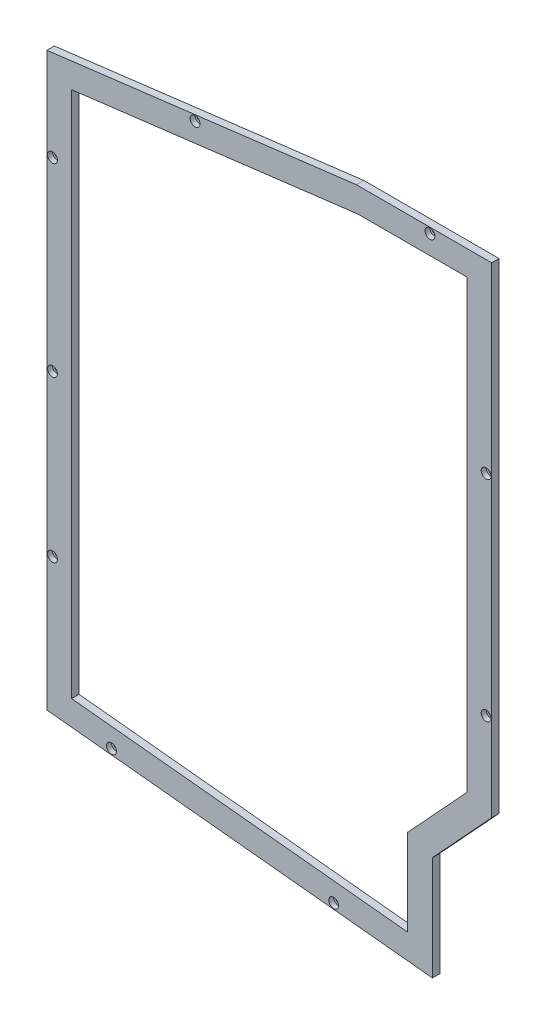
ISO-10303-21;
HEADER;
FILE_DESCRIPTION(('STEP AP214'),'2;1');
FILE_NAME('part.step','',(''),(''),'','','');
FILE_SCHEMA(('AUTOMOTIVE_DESIGN { 1 0 10303 214 1 1 1 1 }'));
ENDSEC;
DATA;
#1=APPLICATION_CONTEXT('core data for automotive mechanical design processes');
#2=APPLICATION_PROTOCOL_DEFINITION('international standard','automotive_design',2000,#1);
#3=PRODUCT_CONTEXT('',#1,'mechanical');
#4=PRODUCT('Part','Part','',(#3));
#5=PRODUCT_RELATED_PRODUCT_CATEGORY('part','',(#4));
#6=PRODUCT_DEFINITION_FORMATION('','',#4);
#7=PRODUCT_DEFINITION_CONTEXT('part definition',#1,'design');
#8=PRODUCT_DEFINITION('design','',#6,#7);
#9=PRODUCT_DEFINITION_SHAPE('','',#8);
#10=(LENGTH_UNIT() NAMED_UNIT(*) SI_UNIT(.MILLI.,.METRE.));
#11=(NAMED_UNIT(*) PLANE_ANGLE_UNIT() SI_UNIT($,.RADIAN.));
#12=(NAMED_UNIT(*) SI_UNIT($,.STERADIAN.) SOLID_ANGLE_UNIT());
#13=UNCERTAINTY_MEASURE_WITH_UNIT(LENGTH_MEASURE(1.E-05),#10,'distance_accuracy_value','');
#14=(GEOMETRIC_REPRESENTATION_CONTEXT(3) GLOBAL_UNCERTAINTY_ASSIGNED_CONTEXT((#13)) GLOBAL_UNIT_ASSIGNED_CONTEXT((#10,
#11,#12)) REPRESENTATION_CONTEXT('',''));
#15=CARTESIAN_POINT('',(0.,0.,0.));
#16=DIRECTION('',(0.,0.,1.));
#17=DIRECTION('',(1.,0.,0.));
#18=AXIS2_PLACEMENT_3D('',#15,#16,#17);
#19=CARTESIAN_POINT('',(-377.3,20.8707920380756,6.));
#20=DIRECTION('',(0.101411272958268,0.994844587720607,0.));
#21=DIRECTION('',(-0.994844587720607,0.101411272958268,0.));
#22=AXIS2_PLACEMENT_3D('',#19,#20,#21);
#23=PLANE('',#22);
#24=DIRECTION('',(0.994844587720607,-0.101411272958268,0.));
#25=VECTOR('',#24,1.);
#26=CARTESIAN_POINT('',(-377.3,20.8707920380756,0.));
#27=LINE('',#26,#25);
#28=CARTESIAN_POINT('',(-377.3,20.8707920380756,0.));
#29=VERTEX_POINT('',#28);
#30=CARTESIAN_POINT('',(-64.9999999999998,-10.9640703472454,0.));
#31=VERTEX_POINT('',#30);
#32=EDGE_CURVE('E153',#29,#31,#27,.T.);
#33=ORIENTED_EDGE('',*,*,#32,.T.);
#34=DIRECTION('',(0.,0.,-1.));
#35=VECTOR('',#34,1.);
#36=CARTESIAN_POINT('',(-64.9999999999998,-10.9640703472454,6.));
#37=LINE('',#36,#35);
#38=CARTESIAN_POINT('',(-64.9999999999998,-10.9640703472454,6.));
#39=VERTEX_POINT('',#38);
#40=EDGE_CURVE('E11',#39,#31,#37,.T.);
#41=ORIENTED_EDGE('',*,*,#40,.F.);
#42=DIRECTION('',(0.994844587720607,-0.101411272958268,0.));
#43=VECTOR('',#42,1.);
#44=CARTESIAN_POINT('',(-377.3,20.8707920380756,6.));
#45=LINE('',#44,#43);
#46=CARTESIAN_POINT('',(-377.3,20.8707920380756,6.));
#47=VERTEX_POINT('',#46);
#48=EDGE_CURVE('E184',#47,#39,#45,.T.);
#49=ORIENTED_EDGE('',*,*,#48,.F.);
#50=DIRECTION('',(0.,0.,-1.));
#51=VECTOR('',#50,1.);
#52=CARTESIAN_POINT('',(-377.3,20.8707920380756,6.));
#53=LINE('',#52,#51);
#54=EDGE_CURVE('E152',#47,#29,#53,.T.);
#55=ORIENTED_EDGE('',*,*,#54,.T.);
#56=EDGE_LOOP('',(#33,#41,#49,#55));
#57=FACE_BOUND('',#56,.T.);
#58=ADVANCED_FACE('F36',(#57),#23,.F.);
#59=CARTESIAN_POINT('',(-64.9999999999998,-10.9640703472454,6.));
#60=DIRECTION('',(-1.,0.,0.));
#61=DIRECTION('',(0.,0.,1.));
#62=AXIS2_PLACEMENT_3D('',#59,#60,#61);
#63=PLANE('',#62);
#64=DIRECTION('',(0.,1.,0.));
#65=VECTOR('',#64,1.);
#66=CARTESIAN_POINT('',(-64.9999999999998,-10.9640703472454,0.));
#67=LINE('',#66,#65);
#68=CARTESIAN_POINT('',(-64.9999999999998,73.4811454902843,0.));
#69=VERTEX_POINT('',#68);
#70=EDGE_CURVE('E157',#31,#69,#67,.T.);
#71=ORIENTED_EDGE('',*,*,#70,.T.);
#72=DIRECTION('',(0.,0.,-1.));
#73=VECTOR('',#72,1.);
#74=CARTESIAN_POINT('',(-64.9999999999998,73.4811454902843,6.));
#75=LINE('',#74,#73);
#76=CARTESIAN_POINT('',(-64.9999999999998,73.4811454902843,6.));
#77=VERTEX_POINT('',#76);
#78=EDGE_CURVE('E46',#77,#69,#75,.T.);
#79=ORIENTED_EDGE('',*,*,#78,.F.);
#80=DIRECTION('',(0.,1.,0.));
#81=VECTOR('',#80,1.);
#82=CARTESIAN_POINT('',(-64.9999999999998,-10.9640703472454,6.));
#83=LINE('',#82,#81);
#84=EDGE_CURVE('E101',#39,#77,#83,.T.);
#85=ORIENTED_EDGE('',*,*,#84,.F.);
#86=ORIENTED_EDGE('',*,*,#40,.T.);
#87=EDGE_LOOP('',(#71,#79,#85,#86));
#88=FACE_BOUND('',#87,.T.);
#89=ADVANCED_FACE('F458',(#88),#63,.F.);
#90=CARTESIAN_POINT('',(-64.9999999999998,73.4811454902843,6.));
#91=DIRECTION('',(-0.734803444627488,0.678280102733065,0.));
#92=DIRECTION('',(-0.678280102733065,-0.734803444627488,0.));
#93=AXIS2_PLACEMENT_3D('',#90,#91,#92);
#94=PLANE('',#93);
#95=DIRECTION('',(0.678280102733065,0.734803444627488,0.));
#96=VECTOR('',#95,1.);
#97=CARTESIAN_POINT('',(-64.9999999999998,73.4811454902843,0.));
#98=LINE('',#97,#96);
#99=CARTESIAN_POINT('',(-16.9999999999999,125.481145490284,0.));
#100=VERTEX_POINT('',#99);
#101=EDGE_CURVE('E161',#69,#100,#98,.T.);
#102=ORIENTED_EDGE('',*,*,#101,.T.);
#103=DIRECTION('',(0.,0.,-1.));
#104=VECTOR('',#103,1.);
#105=CARTESIAN_POINT('',(-16.9999999999999,125.481145490284,6.));
#106=LINE('',#105,#104);
#107=CARTESIAN_POINT('',(-16.9999999999999,125.481145490284,6.));
#108=VERTEX_POINT('',#107);
#109=EDGE_CURVE('E195',#108,#100,#106,.T.);
#110=ORIENTED_EDGE('',*,*,#109,.F.);
#111=DIRECTION('',(0.678280102733065,0.734803444627488,0.));
#112=VECTOR('',#111,1.);
#113=CARTESIAN_POINT('',(-64.9999999999998,73.4811454902843,6.));
#114=LINE('',#113,#112);
#115=EDGE_CURVE('E387',#77,#108,#114,.T.);
#116=ORIENTED_EDGE('',*,*,#115,.F.);
#117=ORIENTED_EDGE('',*,*,#78,.T.);
#118=EDGE_LOOP('',(#102,#110,#116,#117));
#119=FACE_BOUND('',#118,.T.);
#120=ADVANCED_FACE('F460',(#119),#94,.F.);
#121=CARTESIAN_POINT('',(-16.9999999999999,125.481145490284,6.));
#122=DIRECTION('',(-1.,0.,0.));
#123=DIRECTION('',(0.,0.,1.));
#124=AXIS2_PLACEMENT_3D('',#121,#122,#123);
#125=PLANE('',#124);
#126=DIRECTION('',(0.,1.,0.));
#127=VECTOR('',#126,1.);
#128=CARTESIAN_POINT('',(-16.9999999999999,125.481145490284,0.));
#129=LINE('',#128,#127);
#130=CARTESIAN_POINT('',(-16.9999999999999,514.843252999999,0.));
#131=VERTEX_POINT('',#130);
#132=EDGE_CURVE('E164',#100,#131,#129,.T.);
#133=ORIENTED_EDGE('',*,*,#132,.T.);
#134=DIRECTION('',(0.,0.,-1.));
#135=VECTOR('',#134,1.);
#136=CARTESIAN_POINT('',(-16.9999999999999,514.843252999999,6.));
#137=LINE('',#136,#135);
#138=CARTESIAN_POINT('',(-16.9999999999999,514.843252999999,6.));
#139=VERTEX_POINT('',#138);
#140=EDGE_CURVE('E347',#139,#131,#137,.T.);
#141=ORIENTED_EDGE('',*,*,#140,.F.);
#142=DIRECTION('',(0.,1.,0.));
#143=VECTOR('',#142,1.);
#144=CARTESIAN_POINT('',(-16.9999999999999,125.481145490284,6.));
#145=LINE('',#144,#143);
#146=EDGE_CURVE('E390',#108,#139,#145,.T.);
#147=ORIENTED_EDGE('',*,*,#146,.F.);
#148=ORIENTED_EDGE('',*,*,#109,.T.);
#149=EDGE_LOOP('',(#133,#141,#147,#148));
#150=FACE_BOUND('',#149,.T.);
#151=ADVANCED_FACE('F462',(#150),#125,.F.);
#152=CARTESIAN_POINT('',(-36.9999999999999,133.300822178541,6.));
#153=DIRECTION('',(1.,0.,0.));
#154=DIRECTION('',(0.,0.,-1.));
#155=AXIS2_PLACEMENT_3D('',#152,#153,#154);
#156=PLANE('',#155);
#157=DIRECTION('',(0.,-1.,0.));
#158=VECTOR('',#157,1.);
#159=CARTESIAN_POINT('',(-36.9999999999999,133.300822178541,0.));
#160=LINE('',#159,#158);
#161=CARTESIAN_POINT('',(-36.9999999999999,494.843252999999,0.));
#162=VERTEX_POINT('',#161);
#163=CARTESIAN_POINT('',(-36.9999999999999,133.300822178541,0.));
#164=VERTEX_POINT('',#163);
#165=EDGE_CURVE('E168',#162,#164,#160,.T.);
#166=ORIENTED_EDGE('',*,*,#165,.T.);
#167=DIRECTION('',(0.,0.,-1.));
#168=VECTOR('',#167,1.);
#169=CARTESIAN_POINT('',(-36.9999999999999,133.300822178541,6.));
#170=LINE('',#169,#168);
#171=CARTESIAN_POINT('',(-36.9999999999999,133.300822178541,6.));
#172=VERTEX_POINT('',#171);
#173=EDGE_CURVE('E191',#172,#164,#170,.T.);
#174=ORIENTED_EDGE('',*,*,#173,.F.);
#175=DIRECTION('',(0.,-1.,0.));
#176=VECTOR('',#175,1.);
#177=CARTESIAN_POINT('',(-36.9999999999999,133.300822178541,6.));
#178=LINE('',#177,#176);
#179=CARTESIAN_POINT('',(-36.9999999999999,494.843252999999,6.));
#180=VERTEX_POINT('',#179);
#181=EDGE_CURVE('E393',#180,#172,#178,.T.);
#182=ORIENTED_EDGE('',*,*,#181,.F.);
#183=DIRECTION('',(0.,0.,-1.));
#184=VECTOR('',#183,1.);
#185=CARTESIAN_POINT('',(-36.9999999999999,494.843252999999,6.));
#186=LINE('',#185,#184);
#187=EDGE_CURVE('E365',#180,#162,#186,.T.);
#188=ORIENTED_EDGE('',*,*,#187,.T.);
#189=EDGE_LOOP('',(#166,#174,#182,#188));
#190=FACE_BOUND('',#189,.T.);
#191=ADVANCED_FACE('F402',(#190),#156,.F.);
#192=CARTESIAN_POINT('',(-84.9999999999998,81.3008221785412,6.));
#193=DIRECTION('',(0.734803444627488,-0.678280102733065,0.));
#194=DIRECTION('',(0.678280102733065,0.734803444627488,0.));
#195=AXIS2_PLACEMENT_3D('',#192,#193,#194);
#196=PLANE('',#195);
#197=DIRECTION('',(-0.678280102733065,-0.734803444627488,0.));
#198=VECTOR('',#197,1.);
#199=CARTESIAN_POINT('',(-84.9999999999998,81.3008221785412,0.));
#200=LINE('',#199,#198);
#201=CARTESIAN_POINT('',(-84.9999999999998,81.3008221785412,0.));
#202=VERTEX_POINT('',#201);
#203=EDGE_CURVE('E171',#164,#202,#200,.T.);
#204=ORIENTED_EDGE('',*,*,#203,.T.);
#205=DIRECTION('',(0.,0.,-1.));
#206=VECTOR('',#205,1.);
#207=CARTESIAN_POINT('',(-84.9999999999998,81.3008221785412,6.));
#208=LINE('',#207,#206);
#209=CARTESIAN_POINT('',(-84.9999999999998,81.3008221785412,6.));
#210=VERTEX_POINT('',#209);
#211=EDGE_CURVE('E136',#210,#202,#208,.T.);
#212=ORIENTED_EDGE('',*,*,#211,.F.);
#213=DIRECTION('',(-0.678280102733065,-0.734803444627488,0.));
#214=VECTOR('',#213,1.);
#215=CARTESIAN_POINT('',(-84.9999999999998,81.3008221785412,6.));
#216=LINE('',#215,#214);
#217=EDGE_CURVE('E125',#172,#210,#216,.T.);
#218=ORIENTED_EDGE('',*,*,#217,.F.);
#219=ORIENTED_EDGE('',*,*,#173,.T.);
#220=EDGE_LOOP('',(#204,#212,#218,#219));
#221=FACE_BOUND('',#220,.T.);
#222=ADVANCED_FACE('F406',(#221),#196,.F.);
#223=CARTESIAN_POINT('',(-84.9999999999998,11.1783082021886,6.));
#224=DIRECTION('',(1.,0.,0.));
#225=DIRECTION('',(0.,0.,-1.));
#226=AXIS2_PLACEMENT_3D('',#223,#224,#225);
#227=PLANE('',#226);
#228=DIRECTION('',(0.,-1.,0.));
#229=VECTOR('',#228,1.);
#230=CARTESIAN_POINT('',(-84.9999999999998,11.1783082021886,0.));
#231=LINE('',#230,#229);
#232=CARTESIAN_POINT('',(-84.9999999999998,11.1783082021886,0.));
#233=VERTEX_POINT('',#232);
#234=EDGE_CURVE('E134',#202,#233,#231,.T.);
#235=ORIENTED_EDGE('',*,*,#234,.T.);
#236=DIRECTION('',(0.,0.,-1.));
#237=VECTOR('',#236,1.);
#238=CARTESIAN_POINT('',(-84.9999999999998,11.1783082021886,6.));
#239=LINE('',#238,#237);
#240=CARTESIAN_POINT('',(-84.9999999999998,11.1783082021886,6.));
#241=VERTEX_POINT('',#240);
#242=EDGE_CURVE('E131',#241,#233,#239,.T.);
#243=ORIENTED_EDGE('',*,*,#242,.F.);
#244=DIRECTION('',(0.,-1.,0.));
#245=VECTOR('',#244,1.);
#246=CARTESIAN_POINT('',(-84.9999999999998,11.1783082021886,6.));
#247=LINE('',#246,#245);
#248=EDGE_CURVE('E118',#210,#241,#247,.T.);
#249=ORIENTED_EDGE('',*,*,#248,.F.);
#250=ORIENTED_EDGE('',*,*,#211,.T.);
#251=EDGE_LOOP('',(#235,#243,#249,#250));
#252=FACE_BOUND('',#251,.T.);
#253=ADVANCED_FACE('F132',(#252),#227,.F.);
#254=CARTESIAN_POINT('',(-357.3,38.9356986201295,6.));
#255=DIRECTION('',(-0.101411272958268,-0.994844587720607,0.));
#256=DIRECTION('',(0.994844587720607,-0.101411272958268,0.));
#257=AXIS2_PLACEMENT_3D('',#254,#255,#256);
#258=PLANE('',#257);
#259=DIRECTION('',(-0.994844587720606,0.101411272958268,0.));
#260=VECTOR('',#259,1.);
#261=CARTESIAN_POINT('',(-357.3,38.9356986201295,0.));
#262=LINE('',#261,#260);
#263=CARTESIAN_POINT('',(-357.3,38.9356986201295,0.));
#264=VERTEX_POINT('',#263);
#265=EDGE_CURVE('E86',#233,#264,#262,.T.);
#266=ORIENTED_EDGE('',*,*,#265,.T.);
#267=DIRECTION('',(0.,0.,-1.));
#268=VECTOR('',#267,1.);
#269=CARTESIAN_POINT('',(-357.3,38.9356986201295,6.));
#270=LINE('',#269,#268);
#271=CARTESIAN_POINT('',(-357.3,38.9356986201295,6.));
#272=VERTEX_POINT('',#271);
#273=EDGE_CURVE('E137',#272,#264,#270,.T.);
#274=ORIENTED_EDGE('',*,*,#273,.F.);
#275=DIRECTION('',(-0.994844587720606,0.101411272958268,0.));
#276=VECTOR('',#275,1.);
#277=CARTESIAN_POINT('',(-357.3,38.9356986201295,6.));
#278=LINE('',#277,#276);
#279=EDGE_CURVE('E123',#241,#272,#278,.T.);
#280=ORIENTED_EDGE('',*,*,#279,.F.);
#281=ORIENTED_EDGE('',*,*,#242,.T.);
#282=EDGE_LOOP('',(#266,#274,#280,#281));
#283=FACE_BOUND('',#282,.T.);
#284=ADVANCED_FACE('F139',(#283),#258,.F.);
#285=CARTESIAN_POINT('',(-357.3,225.481145490284,6.));
#286=DIRECTION('',(-1.,0.,0.));
#287=DIRECTION('',(0.,-1.,0.));
#288=AXIS2_PLACEMENT_3D('',#285,#286,#287);
#289=PLANE('',#288);
#290=DIRECTION('',(0.,1.,0.));
#291=VECTOR('',#290,1.);
#292=CARTESIAN_POINT('',(-357.3,225.481145490284,0.));
#293=LINE('',#292,#291);
#294=CARTESIAN_POINT('',(-357.3,466.121207929504,0.));
#295=VERTEX_POINT('',#294);
#296=EDGE_CURVE('E178',#264,#295,#293,.T.);
#297=ORIENTED_EDGE('',*,*,#296,.T.);
#298=DIRECTION('',(0.,0.,-1.));
#299=VECTOR('',#298,1.);
#300=CARTESIAN_POINT('',(-357.3,466.121207929504,6.));
#301=LINE('',#300,#299);
#302=CARTESIAN_POINT('',(-357.3,466.121207929504,6.));
#303=VERTEX_POINT('',#302);
#304=EDGE_CURVE('E373',#303,#295,#301,.T.);
#305=ORIENTED_EDGE('',*,*,#304,.F.);
#306=DIRECTION('',(0.,1.,0.));
#307=VECTOR('',#306,1.);
#308=CARTESIAN_POINT('',(-357.3,225.481145490284,6.));
#309=LINE('',#308,#307);
#310=EDGE_CURVE('E142',#272,#303,#309,.T.);
#311=ORIENTED_EDGE('',*,*,#310,.F.);
#312=ORIENTED_EDGE('',*,*,#273,.T.);
#313=EDGE_LOOP('',(#297,#305,#311,#312));
#314=FACE_BOUND('',#313,.T.);
#315=ADVANCED_FACE('F415',(#314),#289,.F.);
#316=CARTESIAN_POINT('',(-377.3,239.035929652755,6.));
#317=DIRECTION('',(1.,0.,0.));
#318=DIRECTION('',(0.,1.,0.));
#319=AXIS2_PLACEMENT_3D('',#316,#317,#318);
#320=PLANE('',#319);
#321=DIRECTION('',(0.,-1.,0.));
#322=VECTOR('',#321,1.);
#323=CARTESIAN_POINT('',(-377.3,239.035929652755,0.));
#324=LINE('',#323,#322);
#325=CARTESIAN_POINT('',(-377.3,483.797653512224,0.));
#326=VERTEX_POINT('',#325);
#327=EDGE_CURVE('E93',#326,#29,#324,.T.);
#328=ORIENTED_EDGE('',*,*,#327,.T.);
#329=ORIENTED_EDGE('',*,*,#54,.F.);
#330=DIRECTION('',(0.,-1.,0.));
#331=VECTOR('',#330,1.);
#332=CARTESIAN_POINT('',(-377.3,239.035929652755,6.));
#333=LINE('',#332,#331);
#334=CARTESIAN_POINT('',(-377.3,483.797653512224,6.));
#335=VERTEX_POINT('',#334);
#336=EDGE_CURVE('E55',#335,#47,#333,.T.);
#337=ORIENTED_EDGE('',*,*,#336,.F.);
#338=DIRECTION('',(0.,0.,-1.));
#339=VECTOR('',#338,1.);
#340=CARTESIAN_POINT('',(-377.3,483.797653512224,6.));
#341=LINE('',#340,#339);
#342=EDGE_CURVE('E377',#335,#326,#341,.T.);
#343=ORIENTED_EDGE('',*,*,#342,.T.);
#344=EDGE_LOOP('',(#328,#329,#337,#343));
#345=FACE_BOUND('',#344,.T.);
#346=ADVANCED_FACE('F445',(#345),#320,.F.);
#347=CARTESIAN_POINT('',(0.,0.,6.));
#348=DIRECTION('',(0.,0.,1.));
#349=DIRECTION('',(1.,0.,0.));
#350=AXIS2_PLACEMENT_3D('',#347,#348,#349);
#351=PLANE('',#350);
#352=CARTESIAN_POINT('',(-145.,1.71419316480761,6.));
#353=DIRECTION('',(0.,0.,1.));
#354=DIRECTION('',(1.,0.,0.));
#355=AXIS2_PLACEMENT_3D('',#352,#353,#354);
#356=CIRCLE('',#355,4.);
#357=CARTESIAN_POINT('',(-141.,1.71419316480761,6.));
#358=VERTEX_POINT('',#357);
#359=EDGE_CURVE('E504',#358,#358,#356,.T.);
#360=ORIENTED_EDGE('',*,*,#359,.F.);
#361=EDGE_LOOP('',(#360));
#362=FACE_BOUND('',#361,.T.);
#363=CARTESIAN_POINT('',(-325.,20.0628170180186,6.));
#364=DIRECTION('',(0.,0.,1.));
#365=DIRECTION('',(1.,0.,0.));
#366=AXIS2_PLACEMENT_3D('',#363,#364,#365);
#367=CIRCLE('',#366,4.);
#368=CARTESIAN_POINT('',(-321.,20.0628170180186,6.));
#369=VERTEX_POINT('',#368);
#370=EDGE_CURVE('E262',#369,#369,#367,.T.);
#371=ORIENTED_EDGE('',*,*,#370,.F.);
#372=EDGE_LOOP('',(#371));
#373=FACE_BOUND('',#372,.T.);
#374=CARTESIAN_POINT('',(-372.8,130.870792038076,6.));
#375=DIRECTION('',(0.,0.,1.));
#376=DIRECTION('',(1.,0.,0.));
#377=AXIS2_PLACEMENT_3D('',#374,#375,#376);
#378=CIRCLE('',#377,4.);
#379=CARTESIAN_POINT('',(-368.8,130.870792038076,6.));
#380=VERTEX_POINT('',#379);
#381=EDGE_CURVE('E246',#380,#380,#378,.T.);
#382=ORIENTED_EDGE('',*,*,#381,.F.);
#383=EDGE_LOOP('',(#382));
#384=FACE_BOUND('',#383,.T.);
#385=CARTESIAN_POINT('',(-372.8,260.870792038076,6.));
#386=DIRECTION('',(0.,0.,1.));
#387=DIRECTION('',(1.,0.,0.));
#388=AXIS2_PLACEMENT_3D('',#385,#386,#387);
#389=CIRCLE('',#388,4.);
#390=CARTESIAN_POINT('',(-368.8,260.870792038076,6.));
#391=VERTEX_POINT('',#390);
#392=EDGE_CURVE('E241',#391,#391,#389,.T.);
#393=ORIENTED_EDGE('',*,*,#392,.F.);
#394=EDGE_LOOP('',(#393));
#395=FACE_BOUND('',#394,.T.);
#396=CARTESIAN_POINT('',(-372.8,410.870792038076,6.));
#397=DIRECTION('',(0.,0.,1.));
#398=DIRECTION('',(1.,0.,0.));
#399=AXIS2_PLACEMENT_3D('',#396,#397,#398);
#400=CIRCLE('',#399,4.);
#401=CARTESIAN_POINT('',(-368.8,410.870792038076,6.));
#402=VERTEX_POINT('',#401);
#403=EDGE_CURVE('E236',#402,#402,#400,.T.);
#404=ORIENTED_EDGE('',*,*,#403,.F.);
#405=EDGE_LOOP('',(#404));
#406=FACE_BOUND('',#405,.T.);
#407=CARTESIAN_POINT('',(-257.3,494.120907238778,6.));
#408=DIRECTION('',(0.,0.,1.));
#409=DIRECTION('',(1.,0.,0.));
#410=AXIS2_PLACEMENT_3D('',#407,#408,#409);
#411=CIRCLE('',#410,4.);
#412=CARTESIAN_POINT('',(-253.3,494.120907238778,6.));
#413=VERTEX_POINT('',#412);
#414=EDGE_CURVE('E230',#413,#413,#411,.T.);
#415=ORIENTED_EDGE('',*,*,#414,.F.);
#416=EDGE_LOOP('',(#415));
#417=FACE_BOUND('',#416,.T.);
#418=CARTESIAN_POINT('',(-66.9999999999999,510.343252999999,6.));
#419=DIRECTION('',(0.,0.,1.));
#420=DIRECTION('',(1.,0.,0.));
#421=AXIS2_PLACEMENT_3D('',#418,#419,#420);
#422=CIRCLE('',#421,3.99999999999999);
#423=CARTESIAN_POINT('',(-62.9999999999999,510.343252999999,6.));
#424=VERTEX_POINT('',#423);
#425=EDGE_CURVE('E224',#424,#424,#422,.T.);
#426=ORIENTED_EDGE('',*,*,#425,.F.);
#427=EDGE_LOOP('',(#426));
#428=FACE_BOUND('',#427,.T.);
#429=CARTESIAN_POINT('',(-21.4999999999999,194.843252999999,6.));
#430=DIRECTION('',(0.,0.,1.));
#431=DIRECTION('',(1.,0.,0.));
#432=AXIS2_PLACEMENT_3D('',#429,#430,#431);
#433=CIRCLE('',#432,3.99999999999999);
#434=CARTESIAN_POINT('',(-17.4999999999999,194.843252999999,6.));
#435=VERTEX_POINT('',#434);
#436=EDGE_CURVE('E218',#435,#435,#433,.T.);
#437=ORIENTED_EDGE('',*,*,#436,.F.);
#438=EDGE_LOOP('',(#437));
#439=FACE_BOUND('',#438,.T.);
#440=CARTESIAN_POINT('',(-21.4999999999999,364.843252999999,6.));
#441=DIRECTION('',(0.,0.,1.));
#442=DIRECTION('',(1.,0.,0.));
#443=AXIS2_PLACEMENT_3D('',#440,#441,#442);
#444=CIRCLE('',#443,3.99999999999999);
#445=CARTESIAN_POINT('',(-17.4999999999999,364.843252999999,6.));
#446=VERTEX_POINT('',#445);
#447=EDGE_CURVE('E212',#446,#446,#444,.T.);
#448=ORIENTED_EDGE('',*,*,#447,.F.);
#449=EDGE_LOOP('',(#448));
#450=FACE_BOUND('',#449,.T.);
#451=DIRECTION('',(-0.992422129071766,-0.12287521201879,0.));
#452=VECTOR('',#451,1.);
#453=CARTESIAN_POINT('',(-126.555041470394,514.843253,6.));
#454=LINE('',#453,#452);
#455=CARTESIAN_POINT('',(-126.555041470394,514.843253,6.));
#456=VERTEX_POINT('',#455);
#457=EDGE_CURVE('E335',#456,#335,#454,.T.);
#458=ORIENTED_EDGE('',*,*,#457,.T.);
#459=ORIENTED_EDGE('',*,*,#336,.T.);
#460=ORIENTED_EDGE('',*,*,#48,.T.);
#461=ORIENTED_EDGE('',*,*,#84,.T.);
#462=ORIENTED_EDGE('',*,*,#115,.T.);
#463=ORIENTED_EDGE('',*,*,#146,.T.);
#464=DIRECTION('',(-1.,0.,0.));
#465=VECTOR('',#464,1.);
#466=CARTESIAN_POINT('',(-16.9999999999999,514.843252999999,6.));
#467=LINE('',#466,#465);
#468=EDGE_CURVE('E331',#139,#456,#467,.T.);
#469=ORIENTED_EDGE('',*,*,#468,.T.);
#470=EDGE_LOOP('',(#458,#459,#460,#461,#462,#463,#469));
#471=FACE_BOUND('',#470,.T.);
#472=ORIENTED_EDGE('',*,*,#310,.T.);
#473=DIRECTION('',(0.992422129071766,0.12287521201879,0.));
#474=VECTOR('',#473,1.);
#475=CARTESIAN_POINT('',(-125.321615980625,494.843253,6.));
#476=LINE('',#475,#474);
#477=CARTESIAN_POINT('',(-125.321615980625,494.843253,6.));
#478=VERTEX_POINT('',#477);
#479=EDGE_CURVE('E339',#303,#478,#476,.T.);
#480=ORIENTED_EDGE('',*,*,#479,.T.);
#481=DIRECTION('',(1.,0.,0.));
#482=VECTOR('',#481,1.);
#483=CARTESIAN_POINT('',(-36.9999999999999,494.843252999999,6.));
#484=LINE('',#483,#482);
#485=EDGE_CURVE('E343',#478,#180,#484,.T.);
#486=ORIENTED_EDGE('',*,*,#485,.T.);
#487=ORIENTED_EDGE('',*,*,#181,.T.);
#488=ORIENTED_EDGE('',*,*,#217,.T.);
#489=ORIENTED_EDGE('',*,*,#248,.T.);
#490=ORIENTED_EDGE('',*,*,#279,.T.);
#491=EDGE_LOOP('',(#472,#480,#486,#487,#488,#489,#490));
#492=FACE_BOUND('',#491,.T.);
#493=ADVANCED_FACE('F121',(#362,#373,#384,#395,#406,#417,#428,#439,#450,#471,#492),#351,.T.);
#494=CARTESIAN_POINT('',(0.,0.,0.));
#495=DIRECTION('',(0.,0.,1.));
#496=DIRECTION('',(1.,0.,0.));
#497=AXIS2_PLACEMENT_3D('',#494,#495,#496);
#498=PLANE('',#497);
#499=CARTESIAN_POINT('',(-145.,1.71419316480761,0.));
#500=DIRECTION('',(0.,0.,1.));
#501=DIRECTION('',(1.,0.,0.));
#502=AXIS2_PLACEMENT_3D('',#499,#500,#501);
#503=CIRCLE('',#502,2.14999999999999);
#504=CARTESIAN_POINT('',(-142.85,1.71419316480761,0.));
#505=VERTEX_POINT('',#504);
#506=EDGE_CURVE('E39',#505,#505,#503,.T.);
#507=ORIENTED_EDGE('',*,*,#506,.T.);
#508=EDGE_LOOP('',(#507));
#509=FACE_BOUND('',#508,.T.);
#510=CARTESIAN_POINT('',(-325.,20.0628170180186,0.));
#511=DIRECTION('',(0.,0.,1.));
#512=DIRECTION('',(1.,0.,0.));
#513=AXIS2_PLACEMENT_3D('',#510,#511,#512);
#514=CIRCLE('',#513,2.14999999999999);
#515=CARTESIAN_POINT('',(-322.85,20.0628170180186,0.));
#516=VERTEX_POINT('',#515);
#517=EDGE_CURVE('E243',#516,#516,#514,.T.);
#518=ORIENTED_EDGE('',*,*,#517,.T.);
#519=EDGE_LOOP('',(#518));
#520=FACE_BOUND('',#519,.T.);
#521=CARTESIAN_POINT('',(-372.8,130.870792038076,0.));
#522=DIRECTION('',(0.,0.,1.));
#523=DIRECTION('',(1.,0.,0.));
#524=AXIS2_PLACEMENT_3D('',#521,#522,#523);
#525=CIRCLE('',#524,2.14999999999999);
#526=CARTESIAN_POINT('',(-370.65,130.870792038076,0.));
#527=VERTEX_POINT('',#526);
#528=EDGE_CURVE('E238',#527,#527,#525,.T.);
#529=ORIENTED_EDGE('',*,*,#528,.T.);
#530=EDGE_LOOP('',(#529));
#531=FACE_BOUND('',#530,.T.);
#532=CARTESIAN_POINT('',(-372.8,260.870792038076,0.));
#533=DIRECTION('',(0.,0.,1.));
#534=DIRECTION('',(1.,0.,0.));
#535=AXIS2_PLACEMENT_3D('',#532,#533,#534);
#536=CIRCLE('',#535,2.14999999999999);
#537=CARTESIAN_POINT('',(-370.65,260.870792038076,0.));
#538=VERTEX_POINT('',#537);
#539=EDGE_CURVE('E232',#538,#538,#536,.T.);
#540=ORIENTED_EDGE('',*,*,#539,.T.);
#541=EDGE_LOOP('',(#540));
#542=FACE_BOUND('',#541,.T.);
#543=CARTESIAN_POINT('',(-372.8,410.870792038076,0.));
#544=DIRECTION('',(0.,0.,1.));
#545=DIRECTION('',(1.,0.,0.));
#546=AXIS2_PLACEMENT_3D('',#543,#544,#545);
#547=CIRCLE('',#546,2.14999999999999);
#548=CARTESIAN_POINT('',(-370.65,410.870792038076,0.));
#549=VERTEX_POINT('',#548);
#550=EDGE_CURVE('E226',#549,#549,#547,.T.);
#551=ORIENTED_EDGE('',*,*,#550,.T.);
#552=EDGE_LOOP('',(#551));
#553=FACE_BOUND('',#552,.T.);
#554=CARTESIAN_POINT('',(-257.3,494.120907238778,0.));
#555=DIRECTION('',(0.,0.,1.));
#556=DIRECTION('',(1.,0.,0.));
#557=AXIS2_PLACEMENT_3D('',#554,#555,#556);
#558=CIRCLE('',#557,2.14999999999999);
#559=CARTESIAN_POINT('',(-255.15,494.120907238778,0.));
#560=VERTEX_POINT('',#559);
#561=EDGE_CURVE('E220',#560,#560,#558,.T.);
#562=ORIENTED_EDGE('',*,*,#561,.T.);
#563=EDGE_LOOP('',(#562));
#564=FACE_BOUND('',#563,.T.);
#565=CARTESIAN_POINT('',(-66.9999999999999,510.343252999999,0.));
#566=DIRECTION('',(0.,0.,1.));
#567=DIRECTION('',(1.,0.,0.));
#568=AXIS2_PLACEMENT_3D('',#565,#566,#567);
#569=CIRCLE('',#568,2.15);
#570=CARTESIAN_POINT('',(-64.8499999999999,510.343252999999,0.));
#571=VERTEX_POINT('',#570);
#572=EDGE_CURVE('E214',#571,#571,#569,.T.);
#573=ORIENTED_EDGE('',*,*,#572,.T.);
#574=EDGE_LOOP('',(#573));
#575=FACE_BOUND('',#574,.T.);
#576=CARTESIAN_POINT('',(-21.4999999999999,194.843252999999,0.));
#577=DIRECTION('',(0.,0.,1.));
#578=DIRECTION('',(1.,0.,0.));
#579=AXIS2_PLACEMENT_3D('',#576,#577,#578);
#580=CIRCLE('',#579,2.15);
#581=CARTESIAN_POINT('',(-19.3499999999999,194.843252999999,0.));
#582=VERTEX_POINT('',#581);
#583=EDGE_CURVE('E208',#582,#582,#580,.T.);
#584=ORIENTED_EDGE('',*,*,#583,.T.);
#585=EDGE_LOOP('',(#584));
#586=FACE_BOUND('',#585,.T.);
#587=CARTESIAN_POINT('',(-21.4999999999999,364.843252999999,0.));
#588=DIRECTION('',(0.,0.,1.));
#589=DIRECTION('',(1.,0.,0.));
#590=AXIS2_PLACEMENT_3D('',#587,#588,#589);
#591=CIRCLE('',#590,2.15);
#592=CARTESIAN_POINT('',(-19.3499999999999,364.843252999999,0.));
#593=VERTEX_POINT('',#592);
#594=EDGE_CURVE('E202',#593,#593,#591,.T.);
#595=ORIENTED_EDGE('',*,*,#594,.T.);
#596=EDGE_LOOP('',(#595));
#597=FACE_BOUND('',#596,.T.);
#598=ORIENTED_EDGE('',*,*,#327,.F.);
#599=DIRECTION('',(-0.992422129071766,-0.12287521201879,0.));
#600=VECTOR('',#599,1.);
#601=CARTESIAN_POINT('',(-126.555041470394,514.843253,0.));
#602=LINE('',#601,#600);
#603=CARTESIAN_POINT('',(-126.555041470394,514.843253,0.));
#604=VERTEX_POINT('',#603);
#605=EDGE_CURVE('E351',#604,#326,#602,.T.);
#606=ORIENTED_EDGE('',*,*,#605,.F.);
#607=DIRECTION('',(-1.,0.,0.));
#608=VECTOR('',#607,1.);
#609=CARTESIAN_POINT('',(-16.9999999999999,514.843252999999,0.));
#610=LINE('',#609,#608);
#611=EDGE_CURVE('E206',#131,#604,#610,.T.);
#612=ORIENTED_EDGE('',*,*,#611,.F.);
#613=ORIENTED_EDGE('',*,*,#132,.F.);
#614=ORIENTED_EDGE('',*,*,#101,.F.);
#615=ORIENTED_EDGE('',*,*,#70,.F.);
#616=ORIENTED_EDGE('',*,*,#32,.F.);
#617=EDGE_LOOP('',(#598,#606,#612,#613,#614,#615,#616));
#618=FACE_BOUND('',#617,.T.);
#619=DIRECTION('',(0.992422129071766,0.12287521201879,0.));
#620=VECTOR('',#619,1.);
#621=CARTESIAN_POINT('',(-125.321615980625,494.843253,0.));
#622=LINE('',#621,#620);
#623=CARTESIAN_POINT('',(-125.321615980625,494.843253,0.));
#624=VERTEX_POINT('',#623);
#625=EDGE_CURVE('E355',#295,#624,#622,.T.);
#626=ORIENTED_EDGE('',*,*,#625,.F.);
#627=ORIENTED_EDGE('',*,*,#296,.F.);
#628=ORIENTED_EDGE('',*,*,#265,.F.);
#629=ORIENTED_EDGE('',*,*,#234,.F.);
#630=ORIENTED_EDGE('',*,*,#203,.F.);
#631=ORIENTED_EDGE('',*,*,#165,.F.);
#632=DIRECTION('',(1.,0.,0.));
#633=VECTOR('',#632,1.);
#634=CARTESIAN_POINT('',(-36.9999999999999,494.843252999999,0.));
#635=LINE('',#634,#633);
#636=EDGE_CURVE('E336',#624,#162,#635,.T.);
#637=ORIENTED_EDGE('',*,*,#636,.F.);
#638=EDGE_LOOP('',(#626,#627,#628,#629,#630,#631,#637));
#639=FACE_BOUND('',#638,.T.);
#640=ADVANCED_FACE('F409',(#509,#520,#531,#542,#553,#564,#575,#586,#597,#618,#639),#498,.F.);
#641=CARTESIAN_POINT('',(-16.9999999999999,514.843252999999,6.));
#642=DIRECTION('',(0.,-1.,0.));
#643=DIRECTION('',(1.,0.,0.));
#644=AXIS2_PLACEMENT_3D('',#641,#642,#643);
#645=PLANE('',#644);
#646=ORIENTED_EDGE('',*,*,#611,.T.);
#647=DIRECTION('',(0.,0.,-1.));
#648=VECTOR('',#647,1.);
#649=CARTESIAN_POINT('',(-126.555041470394,514.843253,6.));
#650=LINE('',#649,#648);
#651=EDGE_CURVE('E158',#456,#604,#650,.T.);
#652=ORIENTED_EDGE('',*,*,#651,.F.);
#653=ORIENTED_EDGE('',*,*,#468,.F.);
#654=ORIENTED_EDGE('',*,*,#140,.T.);
#655=EDGE_LOOP('',(#646,#652,#653,#654));
#656=FACE_BOUND('',#655,.T.);
#657=ADVANCED_FACE('F464',(#656),#645,.F.);
#658=CARTESIAN_POINT('',(-126.555041470394,514.843253,6.));
#659=DIRECTION('',(0.12287521201879,-0.992422129071766,0.));
#660=DIRECTION('',(0.992422129071766,0.12287521201879,0.));
#661=AXIS2_PLACEMENT_3D('',#658,#659,#660);
#662=PLANE('',#661);
#663=ORIENTED_EDGE('',*,*,#605,.T.);
#664=ORIENTED_EDGE('',*,*,#342,.F.);
#665=ORIENTED_EDGE('',*,*,#457,.F.);
#666=ORIENTED_EDGE('',*,*,#651,.T.);
#667=EDGE_LOOP('',(#663,#664,#665,#666));
#668=FACE_BOUND('',#667,.T.);
#669=ADVANCED_FACE('F449',(#668),#662,.F.);
#670=CARTESIAN_POINT('',(-125.321615980625,494.843253,6.));
#671=DIRECTION('',(-0.12287521201879,0.992422129071766,0.));
#672=DIRECTION('',(-0.992422129071766,-0.12287521201879,0.));
#673=AXIS2_PLACEMENT_3D('',#670,#671,#672);
#674=PLANE('',#673);
#675=ORIENTED_EDGE('',*,*,#625,.T.);
#676=DIRECTION('',(0.,0.,-1.));
#677=VECTOR('',#676,1.);
#678=CARTESIAN_POINT('',(-125.321615980625,494.843253,6.));
#679=LINE('',#678,#677);
#680=EDGE_CURVE('E369',#478,#624,#679,.T.);
#681=ORIENTED_EDGE('',*,*,#680,.F.);
#682=ORIENTED_EDGE('',*,*,#479,.F.);
#683=ORIENTED_EDGE('',*,*,#304,.T.);
#684=EDGE_LOOP('',(#675,#681,#682,#683));
#685=FACE_BOUND('',#684,.T.);
#686=ADVANCED_FACE('F422',(#685),#674,.F.);
#687=CARTESIAN_POINT('',(-36.9999999999999,494.843252999999,6.));
#688=DIRECTION('',(0.,1.,0.));
#689=DIRECTION('',(-1.,0.,0.));
#690=AXIS2_PLACEMENT_3D('',#687,#688,#689);
#691=PLANE('',#690);
#692=ORIENTED_EDGE('',*,*,#636,.T.);
#693=ORIENTED_EDGE('',*,*,#187,.F.);
#694=ORIENTED_EDGE('',*,*,#485,.F.);
#695=ORIENTED_EDGE('',*,*,#680,.T.);
#696=EDGE_LOOP('',(#692,#693,#694,#695));
#697=FACE_BOUND('',#696,.T.);
#698=ADVANCED_FACE('F543',(#697),#691,.F.);
#699=CARTESIAN_POINT('',(-21.4999999999999,364.843252999999,6.));
#700=DIRECTION('',(0.,0.,1.));
#701=DIRECTION('',(1.,0.,0.));
#702=AXIS2_PLACEMENT_3D('',#699,#700,#701);
#703=CYLINDRICAL_SURFACE('',#702,2.15);
#704=CARTESIAN_POINT('',(-21.4999999999999,364.843252999999,2.));
#705=DIRECTION('',(0.,0.,1.));
#706=DIRECTION('',(1.,0.,0.));
#707=AXIS2_PLACEMENT_3D('',#704,#705,#706);
#708=CIRCLE('',#707,2.15);
#709=CARTESIAN_POINT('',(-19.3499999999999,364.843252999999,2.));
#710=VERTEX_POINT('',#709);
#711=EDGE_CURVE('E207',#710,#710,#708,.T.);
#712=ORIENTED_EDGE('',*,*,#711,.T.);
#713=EDGE_LOOP('',(#712));
#714=FACE_BOUND('',#713,.T.);
#715=ORIENTED_EDGE('',*,*,#594,.F.);
#716=EDGE_LOOP('',(#715));
#717=FACE_BOUND('',#716,.T.);
#718=ADVANCED_FACE('F535',(#714,#717),#703,.F.);
#719=CARTESIAN_POINT('',(-19.3499999999999,364.843252999999,2.));
#720=DIRECTION('',(0.,0.,-1.));
#721=DIRECTION('',(-1.,0.,0.));
#722=AXIS2_PLACEMENT_3D('',#719,#720,#721);
#723=PLANE('',#722);
#724=ORIENTED_EDGE('',*,*,#711,.F.);
#725=EDGE_LOOP('',(#724));
#726=FACE_BOUND('',#725,.T.);
#727=CARTESIAN_POINT('',(-21.4999999999999,364.843252999999,2.));
#728=DIRECTION('',(0.,0.,1.));
#729=DIRECTION('',(1.,0.,0.));
#730=AXIS2_PLACEMENT_3D('',#727,#728,#729);
#731=CIRCLE('',#730,4.);
#732=CARTESIAN_POINT('',(-17.4999999999999,364.843252999999,2.));
#733=VERTEX_POINT('',#732);
#734=EDGE_CURVE('E324',#733,#733,#731,.T.);
#735=ORIENTED_EDGE('',*,*,#734,.T.);
#736=EDGE_LOOP('',(#735));
#737=FACE_BOUND('',#736,.T.);
#738=ADVANCED_FACE('F525',(#726,#737),#723,.F.);
#739=CARTESIAN_POINT('',(-21.4999999999999,364.843252999999,6.));
#740=DIRECTION('',(0.,0.,1.));
#741=DIRECTION('',(1.,0.,0.));
#742=AXIS2_PLACEMENT_3D('',#739,#740,#741);
#743=CYLINDRICAL_SURFACE('',#742,3.99999999999999);
#744=ORIENTED_EDGE('',*,*,#734,.F.);
#745=EDGE_LOOP('',(#744));
#746=FACE_BOUND('',#745,.T.);
#747=ORIENTED_EDGE('',*,*,#447,.T.);
#748=EDGE_LOOP('',(#747));
#749=FACE_BOUND('',#748,.T.);
#750=ADVANCED_FACE('F522',(#746,#749),#743,.F.);
#751=CARTESIAN_POINT('',(-21.4999999999999,194.843252999999,6.));
#752=DIRECTION('',(0.,0.,1.));
#753=DIRECTION('',(1.,0.,0.));
#754=AXIS2_PLACEMENT_3D('',#751,#752,#753);
#755=CYLINDRICAL_SURFACE('',#754,2.15);
#756=CARTESIAN_POINT('',(-21.4999999999999,194.843252999999,2.));
#757=DIRECTION('',(0.,0.,1.));
#758=DIRECTION('',(1.,0.,0.));
#759=AXIS2_PLACEMENT_3D('',#756,#757,#758);
#760=CIRCLE('',#759,2.15);
#761=CARTESIAN_POINT('',(-19.3499999999999,194.843252999999,2.));
#762=VERTEX_POINT('',#761);
#763=EDGE_CURVE('E213',#762,#762,#760,.T.);
#764=ORIENTED_EDGE('',*,*,#763,.T.);
#765=EDGE_LOOP('',(#764));
#766=FACE_BOUND('',#765,.T.);
#767=ORIENTED_EDGE('',*,*,#583,.F.);
#768=EDGE_LOOP('',(#767));
#769=FACE_BOUND('',#768,.T.);
#770=ADVANCED_FACE('F524',(#766,#769),#755,.F.);
#771=CARTESIAN_POINT('',(-19.3499999999999,194.843252999999,2.));
#772=DIRECTION('',(0.,0.,-1.));
#773=DIRECTION('',(-1.,0.,0.));
#774=AXIS2_PLACEMENT_3D('',#771,#772,#773);
#775=PLANE('',#774);
#776=ORIENTED_EDGE('',*,*,#763,.F.);
#777=EDGE_LOOP('',(#776));
#778=FACE_BOUND('',#777,.T.);
#779=CARTESIAN_POINT('',(-21.4999999999999,194.843252999999,2.));
#780=DIRECTION('',(0.,0.,1.));
#781=DIRECTION('',(1.,0.,0.));
#782=AXIS2_PLACEMENT_3D('',#779,#780,#781);
#783=CIRCLE('',#782,4.);
#784=CARTESIAN_POINT('',(-17.4999999999999,194.843252999999,2.));
#785=VERTEX_POINT('',#784);
#786=EDGE_CURVE('E314',#785,#785,#783,.T.);
#787=ORIENTED_EDGE('',*,*,#786,.T.);
#788=EDGE_LOOP('',(#787));
#789=FACE_BOUND('',#788,.T.);
#790=ADVANCED_FACE('F532',(#778,#789),#775,.F.);
#791=CARTESIAN_POINT('',(-21.4999999999999,194.843252999999,6.));
#792=DIRECTION('',(0.,0.,1.));
#793=DIRECTION('',(1.,0.,0.));
#794=AXIS2_PLACEMENT_3D('',#791,#792,#793);
#795=CYLINDRICAL_SURFACE('',#794,3.99999999999999);
#796=ORIENTED_EDGE('',*,*,#786,.F.);
#797=EDGE_LOOP('',(#796));
#798=FACE_BOUND('',#797,.T.);
#799=ORIENTED_EDGE('',*,*,#436,.T.);
#800=EDGE_LOOP('',(#799));
#801=FACE_BOUND('',#800,.T.);
#802=ADVANCED_FACE('F577',(#798,#801),#795,.F.);
#803=CARTESIAN_POINT('',(-66.9999999999999,510.343252999999,6.));
#804=DIRECTION('',(0.,0.,1.));
#805=DIRECTION('',(1.,0.,0.));
#806=AXIS2_PLACEMENT_3D('',#803,#804,#805);
#807=CYLINDRICAL_SURFACE('',#806,2.15);
#808=CARTESIAN_POINT('',(-66.9999999999999,510.343252999999,2.));
#809=DIRECTION('',(0.,0.,1.));
#810=DIRECTION('',(1.,0.,0.));
#811=AXIS2_PLACEMENT_3D('',#808,#809,#810);
#812=CIRCLE('',#811,2.15);
#813=CARTESIAN_POINT('',(-64.8499999999999,510.343252999999,2.));
#814=VERTEX_POINT('',#813);
#815=EDGE_CURVE('E219',#814,#814,#812,.T.);
#816=ORIENTED_EDGE('',*,*,#815,.T.);
#817=EDGE_LOOP('',(#816));
#818=FACE_BOUND('',#817,.T.);
#819=ORIENTED_EDGE('',*,*,#572,.F.);
#820=EDGE_LOOP('',(#819));
#821=FACE_BOUND('',#820,.T.);
#822=ADVANCED_FACE('F585',(#818,#821),#807,.F.);
#823=CARTESIAN_POINT('',(-64.8499999999999,510.343252999999,2.));
#824=DIRECTION('',(0.,0.,-1.));
#825=DIRECTION('',(-1.,0.,0.));
#826=AXIS2_PLACEMENT_3D('',#823,#824,#825);
#827=PLANE('',#826);
#828=ORIENTED_EDGE('',*,*,#815,.F.);
#829=EDGE_LOOP('',(#828));
#830=FACE_BOUND('',#829,.T.);
#831=CARTESIAN_POINT('',(-66.9999999999999,510.343252999999,2.));
#832=DIRECTION('',(0.,0.,1.));
#833=DIRECTION('',(1.,0.,0.));
#834=AXIS2_PLACEMENT_3D('',#831,#832,#833);
#835=CIRCLE('',#834,4.);
#836=CARTESIAN_POINT('',(-62.9999999999999,510.343252999999,2.));
#837=VERTEX_POINT('',#836);
#838=EDGE_CURVE('E304',#837,#837,#835,.T.);
#839=ORIENTED_EDGE('',*,*,#838,.T.);
#840=EDGE_LOOP('',(#839));
#841=FACE_BOUND('',#840,.T.);
#842=ADVANCED_FACE('F594',(#830,#841),#827,.F.);
#843=CARTESIAN_POINT('',(-66.9999999999999,510.343252999999,6.));
#844=DIRECTION('',(0.,0.,1.));
#845=DIRECTION('',(1.,0.,0.));
#846=AXIS2_PLACEMENT_3D('',#843,#844,#845);
#847=CYLINDRICAL_SURFACE('',#846,4.);
#848=ORIENTED_EDGE('',*,*,#838,.F.);
#849=EDGE_LOOP('',(#848));
#850=FACE_BOUND('',#849,.T.);
#851=ORIENTED_EDGE('',*,*,#425,.T.);
#852=EDGE_LOOP('',(#851));
#853=FACE_BOUND('',#852,.T.);
#854=ADVANCED_FACE('F603',(#850,#853),#847,.F.);
#855=CARTESIAN_POINT('',(-257.3,494.120907238778,6.));
#856=DIRECTION('',(0.,0.,1.));
#857=DIRECTION('',(1.,0.,0.));
#858=AXIS2_PLACEMENT_3D('',#855,#856,#857);
#859=CYLINDRICAL_SURFACE('',#858,2.14999999999999);
#860=CARTESIAN_POINT('',(-257.3,494.120907238778,2.));
#861=DIRECTION('',(0.,0.,1.));
#862=DIRECTION('',(1.,0.,0.));
#863=AXIS2_PLACEMENT_3D('',#860,#861,#862);
#864=CIRCLE('',#863,2.14999999999999);
#865=CARTESIAN_POINT('',(-255.15,494.120907238778,2.));
#866=VERTEX_POINT('',#865);
#867=EDGE_CURVE('E225',#866,#866,#864,.T.);
#868=ORIENTED_EDGE('',*,*,#867,.T.);
#869=EDGE_LOOP('',(#868));
#870=FACE_BOUND('',#869,.T.);
#871=ORIENTED_EDGE('',*,*,#561,.F.);
#872=EDGE_LOOP('',(#871));
#873=FACE_BOUND('',#872,.T.);
#874=ADVANCED_FACE('F612',(#870,#873),#859,.F.);
#875=CARTESIAN_POINT('',(-255.15,494.120907238778,2.));
#876=DIRECTION('',(0.,0.,-1.));
#877=DIRECTION('',(-1.,0.,0.));
#878=AXIS2_PLACEMENT_3D('',#875,#876,#877);
#879=PLANE('',#878);
#880=ORIENTED_EDGE('',*,*,#867,.F.);
#881=EDGE_LOOP('',(#880));
#882=FACE_BOUND('',#881,.T.);
#883=CARTESIAN_POINT('',(-257.3,494.120907238778,2.));
#884=DIRECTION('',(0.,0.,1.));
#885=DIRECTION('',(1.,0.,0.));
#886=AXIS2_PLACEMENT_3D('',#883,#884,#885);
#887=CIRCLE('',#886,4.);
#888=CARTESIAN_POINT('',(-253.3,494.120907238778,2.));
#889=VERTEX_POINT('',#888);
#890=EDGE_CURVE('E294',#889,#889,#887,.T.);
#891=ORIENTED_EDGE('',*,*,#890,.T.);
#892=EDGE_LOOP('',(#891));
#893=FACE_BOUND('',#892,.T.);
#894=ADVANCED_FACE('F621',(#882,#893),#879,.F.);
#895=CARTESIAN_POINT('',(-257.3,494.120907238778,6.));
#896=DIRECTION('',(0.,0.,1.));
#897=DIRECTION('',(1.,0.,0.));
#898=AXIS2_PLACEMENT_3D('',#895,#896,#897);
#899=CYLINDRICAL_SURFACE('',#898,4.);
#900=ORIENTED_EDGE('',*,*,#890,.F.);
#901=EDGE_LOOP('',(#900));
#902=FACE_BOUND('',#901,.T.);
#903=ORIENTED_EDGE('',*,*,#414,.T.);
#904=EDGE_LOOP('',(#903));
#905=FACE_BOUND('',#904,.T.);
#906=ADVANCED_FACE('F630',(#902,#905),#899,.F.);
#907=CARTESIAN_POINT('',(-372.8,410.870792038076,6.));
#908=DIRECTION('',(0.,0.,1.));
#909=DIRECTION('',(1.,0.,0.));
#910=AXIS2_PLACEMENT_3D('',#907,#908,#909);
#911=CYLINDRICAL_SURFACE('',#910,2.14999999999999);
#912=CARTESIAN_POINT('',(-372.8,410.870792038076,2.));
#913=DIRECTION('',(0.,0.,1.));
#914=DIRECTION('',(1.,0.,0.));
#915=AXIS2_PLACEMENT_3D('',#912,#913,#914);
#916=CIRCLE('',#915,2.14999999999999);
#917=CARTESIAN_POINT('',(-370.65,410.870792038076,2.));
#918=VERTEX_POINT('',#917);
#919=EDGE_CURVE('E231',#918,#918,#916,.T.);
#920=ORIENTED_EDGE('',*,*,#919,.T.);
#921=EDGE_LOOP('',(#920));
#922=FACE_BOUND('',#921,.T.);
#923=ORIENTED_EDGE('',*,*,#550,.F.);
#924=EDGE_LOOP('',(#923));
#925=FACE_BOUND('',#924,.T.);
#926=ADVANCED_FACE('F639',(#922,#925),#911,.F.);
#927=CARTESIAN_POINT('',(-370.65,410.870792038076,2.));
#928=DIRECTION('',(0.,0.,-1.));
#929=DIRECTION('',(-1.,0.,0.));
#930=AXIS2_PLACEMENT_3D('',#927,#928,#929);
#931=PLANE('',#930);
#932=ORIENTED_EDGE('',*,*,#919,.F.);
#933=EDGE_LOOP('',(#932));
#934=FACE_BOUND('',#933,.T.);
#935=CARTESIAN_POINT('',(-372.8,410.870792038076,2.));
#936=DIRECTION('',(0.,0.,1.));
#937=DIRECTION('',(1.,0.,0.));
#938=AXIS2_PLACEMENT_3D('',#935,#936,#937);
#939=CIRCLE('',#938,4.);
#940=CARTESIAN_POINT('',(-368.8,410.870792038076,2.));
#941=VERTEX_POINT('',#940);
#942=EDGE_CURVE('E284',#941,#941,#939,.T.);
#943=ORIENTED_EDGE('',*,*,#942,.T.);
#944=EDGE_LOOP('',(#943));
#945=FACE_BOUND('',#944,.T.);
#946=ADVANCED_FACE('F648',(#934,#945),#931,.F.);
#947=CARTESIAN_POINT('',(-372.8,410.870792038076,6.));
#948=DIRECTION('',(0.,0.,1.));
#949=DIRECTION('',(1.,0.,0.));
#950=AXIS2_PLACEMENT_3D('',#947,#948,#949);
#951=CYLINDRICAL_SURFACE('',#950,4.);
#952=ORIENTED_EDGE('',*,*,#942,.F.);
#953=EDGE_LOOP('',(#952));
#954=FACE_BOUND('',#953,.T.);
#955=ORIENTED_EDGE('',*,*,#403,.T.);
#956=EDGE_LOOP('',(#955));
#957=FACE_BOUND('',#956,.T.);
#958=ADVANCED_FACE('F657',(#954,#957),#951,.F.);
#959=CARTESIAN_POINT('',(-372.8,260.870792038076,6.));
#960=DIRECTION('',(0.,0.,1.));
#961=DIRECTION('',(1.,0.,0.));
#962=AXIS2_PLACEMENT_3D('',#959,#960,#961);
#963=CYLINDRICAL_SURFACE('',#962,2.14999999999999);
#964=CARTESIAN_POINT('',(-372.8,260.870792038076,2.));
#965=DIRECTION('',(0.,0.,1.));
#966=DIRECTION('',(1.,0.,0.));
#967=AXIS2_PLACEMENT_3D('',#964,#965,#966);
#968=CIRCLE('',#967,2.14999999999999);
#969=CARTESIAN_POINT('',(-370.65,260.870792038076,2.));
#970=VERTEX_POINT('',#969);
#971=EDGE_CURVE('E237',#970,#970,#968,.T.);
#972=ORIENTED_EDGE('',*,*,#971,.T.);
#973=EDGE_LOOP('',(#972));
#974=FACE_BOUND('',#973,.T.);
#975=ORIENTED_EDGE('',*,*,#539,.F.);
#976=EDGE_LOOP('',(#975));
#977=FACE_BOUND('',#976,.T.);
#978=ADVANCED_FACE('F666',(#974,#977),#963,.F.);
#979=CARTESIAN_POINT('',(-370.65,260.870792038076,2.));
#980=DIRECTION('',(0.,0.,-1.));
#981=DIRECTION('',(-1.,0.,0.));
#982=AXIS2_PLACEMENT_3D('',#979,#980,#981);
#983=PLANE('',#982);
#984=ORIENTED_EDGE('',*,*,#971,.F.);
#985=EDGE_LOOP('',(#984));
#986=FACE_BOUND('',#985,.T.);
#987=CARTESIAN_POINT('',(-372.8,260.870792038076,2.));
#988=DIRECTION('',(0.,0.,1.));
#989=DIRECTION('',(1.,0.,0.));
#990=AXIS2_PLACEMENT_3D('',#987,#988,#989);
#991=CIRCLE('',#990,4.);
#992=CARTESIAN_POINT('',(-368.8,260.870792038076,2.));
#993=VERTEX_POINT('',#992);
#994=EDGE_CURVE('E275',#993,#993,#991,.T.);
#995=ORIENTED_EDGE('',*,*,#994,.T.);
#996=EDGE_LOOP('',(#995));
#997=FACE_BOUND('',#996,.T.);
#998=ADVANCED_FACE('F675',(#986,#997),#983,.F.);
#999=CARTESIAN_POINT('',(-372.8,260.870792038076,6.));
#1000=DIRECTION('',(0.,0.,1.));
#1001=DIRECTION('',(1.,0.,0.));
#1002=AXIS2_PLACEMENT_3D('',#999,#1000,#1001);
#1003=CYLINDRICAL_SURFACE('',#1002,4.);
#1004=ORIENTED_EDGE('',*,*,#994,.F.);
#1005=EDGE_LOOP('',(#1004));
#1006=FACE_BOUND('',#1005,.T.);
#1007=ORIENTED_EDGE('',*,*,#392,.T.);
#1008=EDGE_LOOP('',(#1007));
#1009=FACE_BOUND('',#1008,.T.);
#1010=ADVANCED_FACE('F684',(#1006,#1009),#1003,.F.);
#1011=CARTESIAN_POINT('',(-372.8,130.870792038076,6.));
#1012=DIRECTION('',(0.,0.,1.));
#1013=DIRECTION('',(1.,0.,0.));
#1014=AXIS2_PLACEMENT_3D('',#1011,#1012,#1013);
#1015=CYLINDRICAL_SURFACE('',#1014,2.14999999999999);
#1016=CARTESIAN_POINT('',(-372.8,130.870792038076,2.));
#1017=DIRECTION('',(0.,0.,1.));
#1018=DIRECTION('',(1.,0.,0.));
#1019=AXIS2_PLACEMENT_3D('',#1016,#1017,#1018);
#1020=CIRCLE('',#1019,2.14999999999999);
#1021=CARTESIAN_POINT('',(-370.65,130.870792038076,2.));
#1022=VERTEX_POINT('',#1021);
#1023=EDGE_CURVE('E242',#1022,#1022,#1020,.T.);
#1024=ORIENTED_EDGE('',*,*,#1023,.T.);
#1025=EDGE_LOOP('',(#1024));
#1026=FACE_BOUND('',#1025,.T.);
#1027=ORIENTED_EDGE('',*,*,#528,.F.);
#1028=EDGE_LOOP('',(#1027));
#1029=FACE_BOUND('',#1028,.T.);
#1030=ADVANCED_FACE('F693',(#1026,#1029),#1015,.F.);
#1031=CARTESIAN_POINT('',(-370.65,130.870792038076,2.));
#1032=DIRECTION('',(0.,0.,-1.));
#1033=DIRECTION('',(-1.,0.,0.));
#1034=AXIS2_PLACEMENT_3D('',#1031,#1032,#1033);
#1035=PLANE('',#1034);
#1036=ORIENTED_EDGE('',*,*,#1023,.F.);
#1037=EDGE_LOOP('',(#1036));
#1038=FACE_BOUND('',#1037,.T.);
#1039=CARTESIAN_POINT('',(-372.8,130.870792038076,2.));
#1040=DIRECTION('',(0.,0.,1.));
#1041=DIRECTION('',(1.,0.,0.));
#1042=AXIS2_PLACEMENT_3D('',#1039,#1040,#1041);
#1043=CIRCLE('',#1042,4.);
#1044=CARTESIAN_POINT('',(-368.8,130.870792038076,2.));
#1045=VERTEX_POINT('',#1044);
#1046=EDGE_CURVE('E253',#1045,#1045,#1043,.T.);
#1047=ORIENTED_EDGE('',*,*,#1046,.T.);
#1048=EDGE_LOOP('',(#1047));
#1049=FACE_BOUND('',#1048,.T.);
#1050=ADVANCED_FACE('F702',(#1038,#1049),#1035,.F.);
#1051=CARTESIAN_POINT('',(-372.8,130.870792038076,6.));
#1052=DIRECTION('',(0.,0.,1.));
#1053=DIRECTION('',(1.,0.,0.));
#1054=AXIS2_PLACEMENT_3D('',#1051,#1052,#1053);
#1055=CYLINDRICAL_SURFACE('',#1054,4.);
#1056=ORIENTED_EDGE('',*,*,#1046,.F.);
#1057=EDGE_LOOP('',(#1056));
#1058=FACE_BOUND('',#1057,.T.);
#1059=ORIENTED_EDGE('',*,*,#381,.T.);
#1060=EDGE_LOOP('',(#1059));
#1061=FACE_BOUND('',#1060,.T.);
#1062=ADVANCED_FACE('F711',(#1058,#1061),#1055,.F.);
#1063=CARTESIAN_POINT('',(-325.,20.0628170180186,6.));
#1064=DIRECTION('',(0.,0.,1.));
#1065=DIRECTION('',(1.,0.,0.));
#1066=AXIS2_PLACEMENT_3D('',#1063,#1064,#1065);
#1067=CYLINDRICAL_SURFACE('',#1066,2.14999999999999);
#1068=CARTESIAN_POINT('',(-325.,20.0628170180186,2.));
#1069=DIRECTION('',(0.,0.,1.));
#1070=DIRECTION('',(1.,0.,0.));
#1071=AXIS2_PLACEMENT_3D('',#1068,#1069,#1070);
#1072=CIRCLE('',#1071,2.14999999999999);
#1073=CARTESIAN_POINT('',(-322.85,20.0628170180186,2.));
#1074=VERTEX_POINT('',#1073);
#1075=EDGE_CURVE('E247',#1074,#1074,#1072,.T.);
#1076=ORIENTED_EDGE('',*,*,#1075,.T.);
#1077=EDGE_LOOP('',(#1076));
#1078=FACE_BOUND('',#1077,.T.);
#1079=ORIENTED_EDGE('',*,*,#517,.F.);
#1080=EDGE_LOOP('',(#1079));
#1081=FACE_BOUND('',#1080,.T.);
#1082=ADVANCED_FACE('F720',(#1078,#1081),#1067,.F.);
#1083=CARTESIAN_POINT('',(-322.85,20.0628170180186,2.));
#1084=DIRECTION('',(0.,0.,-1.));
#1085=DIRECTION('',(-1.,0.,0.));
#1086=AXIS2_PLACEMENT_3D('',#1083,#1084,#1085);
#1087=PLANE('',#1086);
#1088=ORIENTED_EDGE('',*,*,#1075,.F.);
#1089=EDGE_LOOP('',(#1088));
#1090=FACE_BOUND('',#1089,.T.);
#1091=CARTESIAN_POINT('',(-325.,20.0628170180186,2.));
#1092=DIRECTION('',(0.,0.,1.));
#1093=DIRECTION('',(1.,0.,0.));
#1094=AXIS2_PLACEMENT_3D('',#1091,#1092,#1093);
#1095=CIRCLE('',#1094,4.);
#1096=CARTESIAN_POINT('',(-321.,20.0628170180186,2.));
#1097=VERTEX_POINT('',#1096);
#1098=EDGE_CURVE('E256',#1097,#1097,#1095,.T.);
#1099=ORIENTED_EDGE('',*,*,#1098,.T.);
#1100=EDGE_LOOP('',(#1099));
#1101=FACE_BOUND('',#1100,.T.);
#1102=ADVANCED_FACE('F729',(#1090,#1101),#1087,.F.);
#1103=CARTESIAN_POINT('',(-325.,20.0628170180186,6.));
#1104=DIRECTION('',(0.,0.,1.));
#1105=DIRECTION('',(1.,0.,0.));
#1106=AXIS2_PLACEMENT_3D('',#1103,#1104,#1105);
#1107=CYLINDRICAL_SURFACE('',#1106,4.);
#1108=ORIENTED_EDGE('',*,*,#1098,.F.);
#1109=EDGE_LOOP('',(#1108));
#1110=FACE_BOUND('',#1109,.T.);
#1111=ORIENTED_EDGE('',*,*,#370,.T.);
#1112=EDGE_LOOP('',(#1111));
#1113=FACE_BOUND('',#1112,.T.);
#1114=ADVANCED_FACE('F737',(#1110,#1113),#1107,.F.);
#1115=CARTESIAN_POINT('',(-145.,1.71419316480761,6.));
#1116=DIRECTION('',(0.,0.,1.));
#1117=DIRECTION('',(1.,0.,0.));
#1118=AXIS2_PLACEMENT_3D('',#1115,#1116,#1117);
#1119=CYLINDRICAL_SURFACE('',#1118,2.14999999999999);
#1120=CARTESIAN_POINT('',(-145.,1.71419316480761,2.));
#1121=DIRECTION('',(0.,0.,1.));
#1122=DIRECTION('',(1.,0.,0.));
#1123=AXIS2_PLACEMENT_3D('',#1120,#1121,#1122);
#1124=CIRCLE('',#1123,2.14999999999999);
#1125=CARTESIAN_POINT('',(-142.85,1.71419316480761,2.));
#1126=VERTEX_POINT('',#1125);
#1127=EDGE_CURVE('E954',#1126,#1126,#1124,.T.);
#1128=ORIENTED_EDGE('',*,*,#1127,.T.);
#1129=EDGE_LOOP('',(#1128));
#1130=FACE_BOUND('',#1129,.T.);
#1131=ORIENTED_EDGE('',*,*,#506,.F.);
#1132=EDGE_LOOP('',(#1131));
#1133=FACE_BOUND('',#1132,.T.);
#1134=ADVANCED_FACE('F746',(#1130,#1133),#1119,.F.);
#1135=CARTESIAN_POINT('',(-142.85,1.71419316480761,2.));
#1136=DIRECTION('',(0.,0.,-1.));
#1137=DIRECTION('',(-1.,0.,0.));
#1138=AXIS2_PLACEMENT_3D('',#1135,#1136,#1137);
#1139=PLANE('',#1138);
#1140=ORIENTED_EDGE('',*,*,#1127,.F.);
#1141=EDGE_LOOP('',(#1140));
#1142=FACE_BOUND('',#1141,.T.);
#1143=CARTESIAN_POINT('',(-145.,1.71419316480761,2.));
#1144=DIRECTION('',(0.,0.,1.));
#1145=DIRECTION('',(1.,0.,0.));
#1146=AXIS2_PLACEMENT_3D('',#1143,#1144,#1145);
#1147=CIRCLE('',#1146,4.);
#1148=CARTESIAN_POINT('',(-141.,1.71419316480761,2.));
#1149=VERTEX_POINT('',#1148);
#1150=EDGE_CURVE('E950',#1149,#1149,#1147,.T.);
#1151=ORIENTED_EDGE('',*,*,#1150,.T.);
#1152=EDGE_LOOP('',(#1151));
#1153=FACE_BOUND('',#1152,.T.);
#1154=ADVANCED_FACE('F755',(#1142,#1153),#1139,.F.);
#1155=CARTESIAN_POINT('',(-145.,1.71419316480761,6.));
#1156=DIRECTION('',(0.,0.,1.));
#1157=DIRECTION('',(1.,0.,0.));
#1158=AXIS2_PLACEMENT_3D('',#1155,#1156,#1157);
#1159=CYLINDRICAL_SURFACE('',#1158,4.);
#1160=ORIENTED_EDGE('',*,*,#1150,.F.);
#1161=EDGE_LOOP('',(#1160));
#1162=FACE_BOUND('',#1161,.T.);
#1163=ORIENTED_EDGE('',*,*,#359,.T.);
#1164=EDGE_LOOP('',(#1163));
#1165=FACE_BOUND('',#1164,.T.);
#1166=ADVANCED_FACE('F764',(#1162,#1165),#1159,.F.);
#1167=CLOSED_SHELL('',(#58,#89,#120,#151,#191,#222,#253,#284,#315,#346,#493,#640,#657,#669,#686,
#698,#718,#738,#750,#770,#790,#802,#822,#842,#854,#874,#894,#906,#926,#946,#958,#978,#998,#1010,
#1030,#1050,#1062,#1082,#1102,#1114,#1134,#1154,#1166));
#1168=MANIFOLD_SOLID_BREP('B2',#1167);
#1169=ADVANCED_BREP_SHAPE_REPRESENTATION('',(#18,#1168),#14);
#1170=SHAPE_DEFINITION_REPRESENTATION(#9,#1169);
ENDSEC;
END-ISO-10303-21;
